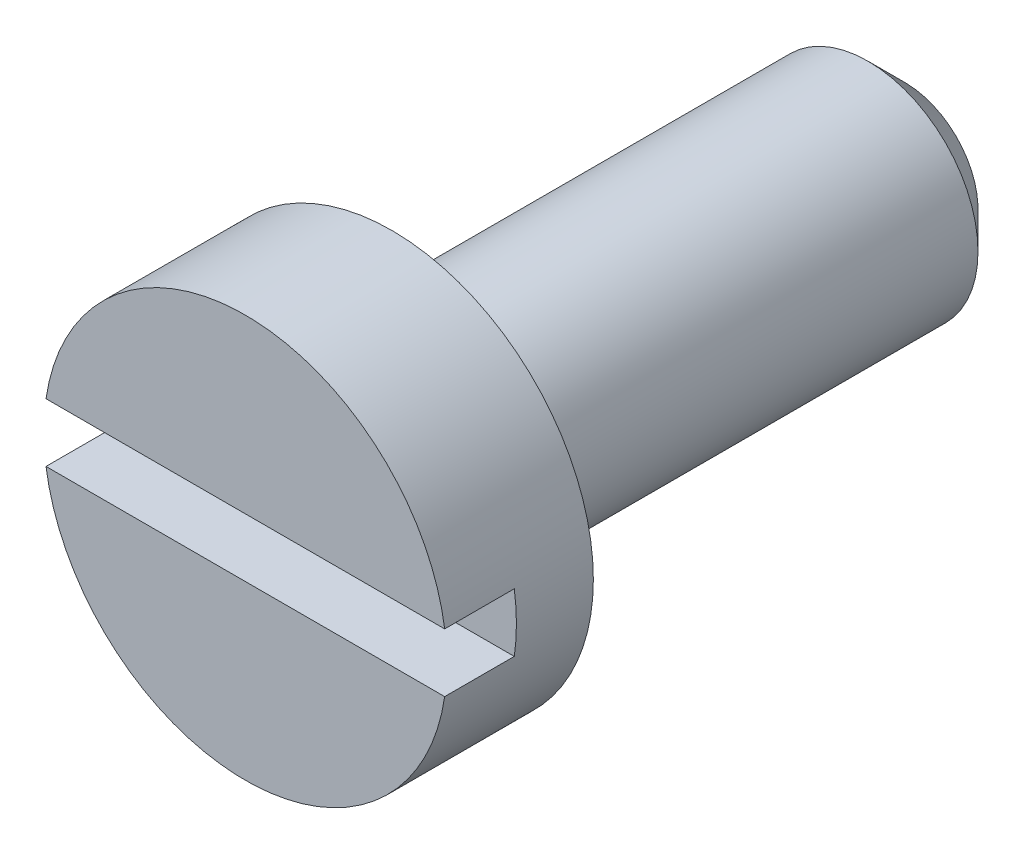
ISO-10303-21;
HEADER;
FILE_DESCRIPTION(('STEP AP214'),'2;1');
FILE_NAME('part.step','',(''),(''),'','','');
FILE_SCHEMA(('AUTOMOTIVE_DESIGN { 1 0 10303 214 1 1 1 1 }'));
ENDSEC;
DATA;
#1=APPLICATION_CONTEXT('core data for automotive mechanical design processes');
#2=APPLICATION_PROTOCOL_DEFINITION('international standard','automotive_design',2000,#1);
#3=PRODUCT_CONTEXT('',#1,'mechanical');
#4=PRODUCT('Part','Part','',(#3));
#5=PRODUCT_RELATED_PRODUCT_CATEGORY('part','',(#4));
#6=PRODUCT_DEFINITION_FORMATION('','',#4);
#7=PRODUCT_DEFINITION_CONTEXT('part definition',#1,'design');
#8=PRODUCT_DEFINITION('design','',#6,#7);
#9=PRODUCT_DEFINITION_SHAPE('','',#8);
#10=(LENGTH_UNIT() NAMED_UNIT(*) SI_UNIT(.MILLI.,.METRE.));
#11=(NAMED_UNIT(*) PLANE_ANGLE_UNIT() SI_UNIT($,.RADIAN.));
#12=(NAMED_UNIT(*) SI_UNIT($,.STERADIAN.) SOLID_ANGLE_UNIT());
#13=UNCERTAINTY_MEASURE_WITH_UNIT(LENGTH_MEASURE(1.E-05),#10,'distance_accuracy_value','');
#14=(GEOMETRIC_REPRESENTATION_CONTEXT(3) GLOBAL_UNCERTAINTY_ASSIGNED_CONTEXT((#13)) GLOBAL_UNIT_ASSIGNED_CONTEXT((#10,
#11,#12)) REPRESENTATION_CONTEXT('',''));
#15=CARTESIAN_POINT('',(0.,0.,0.));
#16=DIRECTION('',(0.,0.,1.));
#17=DIRECTION('',(1.,0.,0.));
#18=AXIS2_PLACEMENT_3D('',#15,#16,#17);
#19=CARTESIAN_POINT('',(0.,0.,2.));
#20=DIRECTION('',(0.,0.,1.));
#21=DIRECTION('',(1.,0.,0.));
#22=AXIS2_PLACEMENT_3D('',#19,#20,#21);
#23=PLANE('',#22);
#24=DIRECTION('',(-1.,0.,0.));
#25=VECTOR('',#24,1.);
#26=CARTESIAN_POINT('',(0.,0.4,2.));
#27=LINE('',#26,#25);
#28=CARTESIAN_POINT('',(2.72075357208256,0.4,2.));
#29=VERTEX_POINT('',#28);
#30=CARTESIAN_POINT('',(-2.72075357208256,0.4,2.));
#31=VERTEX_POINT('',#30);
#32=EDGE_CURVE('E77',#29,#31,#27,.T.);
#33=ORIENTED_EDGE('',*,*,#32,.F.);
#34=CARTESIAN_POINT('',(0.,0.,2.));
#35=DIRECTION('',(0.,0.,1.));
#36=DIRECTION('',(1.,0.,0.));
#37=AXIS2_PLACEMENT_3D('',#34,#35,#36);
#38=CIRCLE('',#37,2.75);
#39=EDGE_CURVE('E90',#29,#31,#38,.T.);
#40=ORIENTED_EDGE('',*,*,#39,.T.);
#41=EDGE_LOOP('',(#33,#40));
#42=FACE_BOUND('',#41,.T.);
#43=ADVANCED_FACE('F29',(#42),#23,.T.);
#44=CARTESIAN_POINT('',(0.,0.,0.));
#45=DIRECTION('',(0.,0.,1.));
#46=DIRECTION('',(1.,0.,0.));
#47=AXIS2_PLACEMENT_3D('',#44,#45,#46);
#48=PLANE('',#47);
#49=CARTESIAN_POINT('',(0.,0.,0.));
#50=DIRECTION('',(0.,0.,1.));
#51=DIRECTION('',(1.,0.,0.));
#52=AXIS2_PLACEMENT_3D('',#49,#50,#51);
#53=CIRCLE('',#52,2.75);
#54=CARTESIAN_POINT('',(2.75,0.,0.));
#55=VERTEX_POINT('',#54);
#56=EDGE_CURVE('E91',#55,#55,#53,.T.);
#57=ORIENTED_EDGE('',*,*,#56,.F.);
#58=EDGE_LOOP('',(#57));
#59=FACE_BOUND('',#58,.T.);
#60=CARTESIAN_POINT('',(0.,0.,0.));
#61=DIRECTION('',(0.,0.,1.));
#62=DIRECTION('',(1.,0.,0.));
#63=AXIS2_PLACEMENT_3D('',#60,#61,#62);
#64=CIRCLE('',#63,1.5);
#65=CARTESIAN_POINT('',(1.5,0.,0.));
#66=VERTEX_POINT('',#65);
#67=EDGE_CURVE('E78',#66,#66,#64,.F.);
#68=ORIENTED_EDGE('',*,*,#67,.F.);
#69=EDGE_LOOP('',(#68));
#70=FACE_BOUND('',#69,.T.);
#71=ADVANCED_FACE('F118',(#59,#70),#48,.F.);
#72=CARTESIAN_POINT('',(0.,0.,2.));
#73=DIRECTION('',(0.,0.,-1.));
#74=DIRECTION('',(-1.,0.,0.));
#75=AXIS2_PLACEMENT_3D('',#72,#73,#74);
#76=CYLINDRICAL_SURFACE('',#75,2.75);
#77=CARTESIAN_POINT('',(0.,0.,1.05));
#78=DIRECTION('',(0.,0.,1.));
#79=DIRECTION('',(1.,0.,0.));
#80=AXIS2_PLACEMENT_3D('',#77,#78,#79);
#81=CIRCLE('',#80,2.75);
#82=CARTESIAN_POINT('',(-2.72075357208256,0.4,1.05));
#83=VERTEX_POINT('',#82);
#84=CARTESIAN_POINT('',(-2.72075357208256,-0.4,1.05));
#85=VERTEX_POINT('',#84);
#86=EDGE_CURVE('E102',#83,#85,#81,.T.);
#87=ORIENTED_EDGE('',*,*,#86,.F.);
#88=DIRECTION('',(0.,0.,-1.));
#89=VECTOR('',#88,1.);
#90=CARTESIAN_POINT('',(-2.72075357208256,0.4,2.));
#91=LINE('',#90,#89);
#92=EDGE_CURVE('E52',#83,#31,#91,.F.);
#93=ORIENTED_EDGE('',*,*,#92,.T.);
#94=ORIENTED_EDGE('',*,*,#39,.F.);
#95=DIRECTION('',(0.,0.,-1.));
#96=VECTOR('',#95,1.);
#97=CARTESIAN_POINT('',(2.72075357208256,0.4,2.));
#98=LINE('',#97,#96);
#99=CARTESIAN_POINT('',(2.72075357208256,0.4,1.05));
#100=VERTEX_POINT('',#99);
#101=EDGE_CURVE('E95',#29,#100,#98,.T.);
#102=ORIENTED_EDGE('',*,*,#101,.T.);
#103=CARTESIAN_POINT('',(2.72075357208256,-0.4,1.05));
#104=VERTEX_POINT('',#103);
#105=EDGE_CURVE('E86',#104,#100,#81,.T.);
#106=ORIENTED_EDGE('',*,*,#105,.F.);
#107=DIRECTION('',(0.,0.,-1.));
#108=VECTOR('',#107,1.);
#109=CARTESIAN_POINT('',(2.72075357208256,-0.4,2.));
#110=LINE('',#109,#108);
#111=CARTESIAN_POINT('',(2.72075357208256,-0.4,2.));
#112=VERTEX_POINT('',#111);
#113=EDGE_CURVE('E72',#104,#112,#110,.F.);
#114=ORIENTED_EDGE('',*,*,#113,.T.);
#115=CARTESIAN_POINT('',(-2.72075357208256,-0.4,2.));
#116=VERTEX_POINT('',#115);
#117=EDGE_CURVE('E84',#116,#112,#38,.T.);
#118=ORIENTED_EDGE('',*,*,#117,.F.);
#119=DIRECTION('',(0.,0.,-1.));
#120=VECTOR('',#119,1.);
#121=CARTESIAN_POINT('',(-2.72075357208256,-0.4,2.));
#122=LINE('',#121,#120);
#123=EDGE_CURVE('E44',#116,#85,#122,.T.);
#124=ORIENTED_EDGE('',*,*,#123,.T.);
#125=EDGE_LOOP('',(#87,#93,#94,#102,#106,#114,#118,#124));
#126=FACE_BOUND('',#125,.T.);
#127=ORIENTED_EDGE('',*,*,#56,.T.);
#128=EDGE_LOOP('',(#127));
#129=FACE_BOUND('',#128,.T.);
#130=ADVANCED_FACE('F31',(#126,#129),#76,.T.);
#131=DIRECTION('',(1.,0.,0.));
#132=VECTOR('',#131,1.);
#133=CARTESIAN_POINT('',(0.,-0.4,2.));
#134=LINE('',#133,#132);
#135=EDGE_CURVE('E69',#116,#112,#134,.T.);
#136=ORIENTED_EDGE('',*,*,#135,.F.);
#137=ORIENTED_EDGE('',*,*,#117,.T.);
#138=EDGE_LOOP('',(#136,#137));
#139=FACE_BOUND('',#138,.T.);
#140=ADVANCED_FACE('F89',(#139),#23,.T.);
#141=CARTESIAN_POINT('',(0.,0.,-7.));
#142=DIRECTION('',(0.,0.,1.));
#143=DIRECTION('',(1.,0.,0.));
#144=AXIS2_PLACEMENT_3D('',#141,#142,#143);
#145=CYLINDRICAL_SURFACE('',#144,1.5);
#146=CARTESIAN_POINT('',(0.,0.,-6.5));
#147=DIRECTION('',(0.,0.,-1.));
#148=DIRECTION('',(-1.,0.,0.));
#149=AXIS2_PLACEMENT_3D('',#146,#147,#148);
#150=CIRCLE('',#149,1.5);
#151=CARTESIAN_POINT('',(-1.5,0.,-6.5));
#152=VERTEX_POINT('',#151);
#153=EDGE_CURVE('E11',#152,#152,#150,.F.);
#154=ORIENTED_EDGE('',*,*,#153,.T.);
#155=EDGE_LOOP('',(#154));
#156=FACE_BOUND('',#155,.T.);
#157=ORIENTED_EDGE('',*,*,#67,.T.);
#158=EDGE_LOOP('',(#157));
#159=FACE_BOUND('',#158,.T.);
#160=ADVANCED_FACE('F126',(#156,#159),#145,.T.);
#161=CARTESIAN_POINT('',(0.,0.,-7.));
#162=DIRECTION('',(0.,0.,-1.));
#163=DIRECTION('',(-1.,0.,0.));
#164=AXIS2_PLACEMENT_3D('',#161,#162,#163);
#165=PLANE('',#164);
#166=CARTESIAN_POINT('',(0.,0.,-7.));
#167=DIRECTION('',(0.,0.,-1.));
#168=DIRECTION('',(-1.,0.,0.));
#169=AXIS2_PLACEMENT_3D('',#166,#167,#168);
#170=CIRCLE('',#169,1.);
#171=CARTESIAN_POINT('',(-1.,0.,-7.));
#172=VERTEX_POINT('',#171);
#173=EDGE_CURVE('E37',#172,#172,#170,.T.);
#174=ORIENTED_EDGE('',*,*,#173,.T.);
#175=EDGE_LOOP('',(#174));
#176=FACE_BOUND('',#175,.T.);
#177=ADVANCED_FACE('F131',(#176),#165,.T.);
#178=CARTESIAN_POINT('',(-3.03159041394335,0.4,1.05));
#179=DIRECTION('',(0.,0.,1.));
#180=DIRECTION('',(1.,0.,0.));
#181=AXIS2_PLACEMENT_3D('',#178,#179,#180);
#182=PLANE('',#181);
#183=ORIENTED_EDGE('',*,*,#86,.T.);
#184=DIRECTION('',(1.,0.,0.));
#185=VECTOR('',#184,1.);
#186=CARTESIAN_POINT('',(-3.03159041394335,-0.4,1.05));
#187=LINE('',#186,#185);
#188=EDGE_CURVE('E108',#85,#104,#187,.T.);
#189=ORIENTED_EDGE('',*,*,#188,.T.);
#190=ORIENTED_EDGE('',*,*,#105,.T.);
#191=DIRECTION('',(-1.,0.,0.));
#192=VECTOR('',#191,1.);
#193=CARTESIAN_POINT('',(-3.03159041394335,0.4,1.05));
#194=LINE('',#193,#192);
#195=EDGE_CURVE('E87',#100,#83,#194,.T.);
#196=ORIENTED_EDGE('',*,*,#195,.T.);
#197=EDGE_LOOP('',(#183,#189,#190,#196));
#198=FACE_BOUND('',#197,.T.);
#199=ADVANCED_FACE('F107',(#198),#182,.T.);
#200=CARTESIAN_POINT('',(-3.03159041394335,0.4,1.05));
#201=DIRECTION('',(0.,1.,0.));
#202=DIRECTION('',(0.,0.,1.));
#203=AXIS2_PLACEMENT_3D('',#200,#201,#202);
#204=PLANE('',#203);
#205=ORIENTED_EDGE('',*,*,#32,.T.);
#206=ORIENTED_EDGE('',*,*,#92,.F.);
#207=ORIENTED_EDGE('',*,*,#195,.F.);
#208=ORIENTED_EDGE('',*,*,#101,.F.);
#209=EDGE_LOOP('',(#205,#206,#207,#208));
#210=FACE_BOUND('',#209,.T.);
#211=ADVANCED_FACE('F115',(#210),#204,.F.);
#212=CARTESIAN_POINT('',(-3.03159041394335,-0.4,1.05));
#213=DIRECTION('',(0.,-1.,0.));
#214=DIRECTION('',(1.,0.,0.));
#215=AXIS2_PLACEMENT_3D('',#212,#213,#214);
#216=PLANE('',#215);
#217=ORIENTED_EDGE('',*,*,#135,.T.);
#218=ORIENTED_EDGE('',*,*,#113,.F.);
#219=ORIENTED_EDGE('',*,*,#188,.F.);
#220=ORIENTED_EDGE('',*,*,#123,.F.);
#221=EDGE_LOOP('',(#217,#218,#219,#220));
#222=FACE_BOUND('',#221,.T.);
#223=ADVANCED_FACE('F71',(#222),#216,.F.);
#224=CARTESIAN_POINT('',(0.,0.,-7.));
#225=DIRECTION('',(0.,0.,1.));
#226=DIRECTION('',(1.,0.,0.));
#227=AXIS2_PLACEMENT_3D('',#224,#225,#226);
#228=CONICAL_SURFACE('',#227,1.,0.785398163397447);
#229=ORIENTED_EDGE('',*,*,#153,.F.);
#230=EDGE_LOOP('',(#229));
#231=FACE_BOUND('',#230,.T.);
#232=ORIENTED_EDGE('',*,*,#173,.F.);
#233=EDGE_LOOP('',(#232));
#234=FACE_BOUND('',#233,.T.);
#235=ADVANCED_FACE('F173',(#231,#234),#228,.T.);
#236=CLOSED_SHELL('',(#43,#71,#130,#140,#160,#177,#199,#211,#223,#235));
#237=MANIFOLD_SOLID_BREP('B2',#236);
#238=ADVANCED_BREP_SHAPE_REPRESENTATION('',(#18,#237),#14);
#239=SHAPE_DEFINITION_REPRESENTATION(#9,#238);
ENDSEC;
END-ISO-10303-21;
